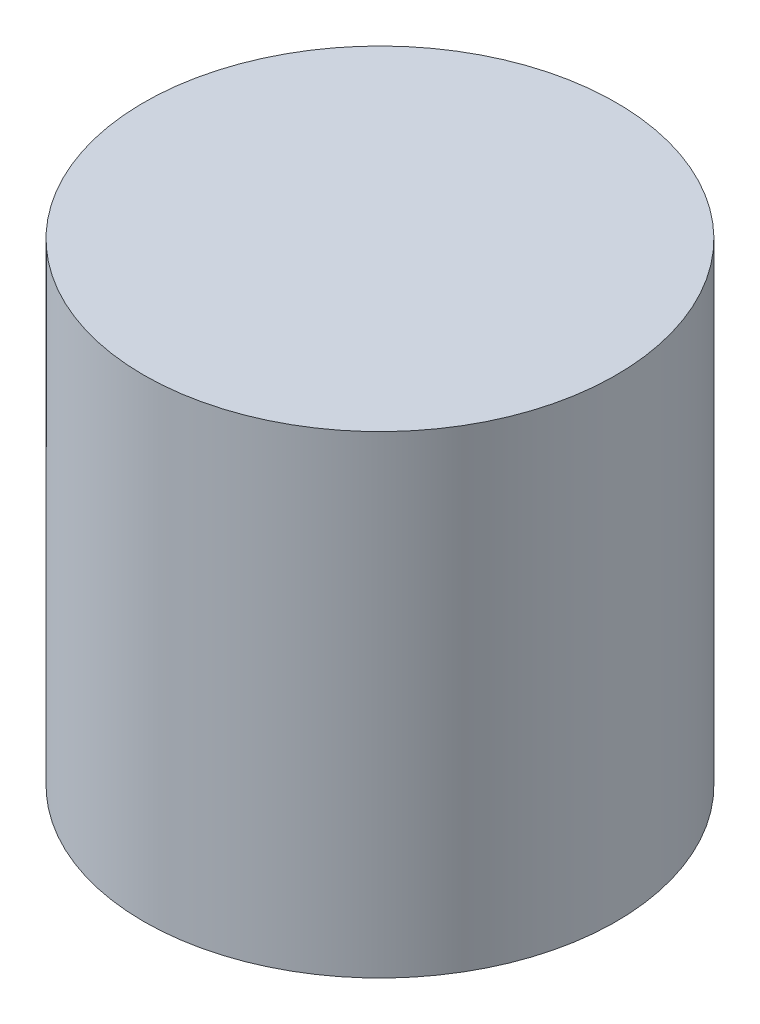
ISO-10303-21;
HEADER;
FILE_DESCRIPTION(('STEP AP214'),'2;1');
FILE_NAME('part.step','',(''),(''),'','','');
FILE_SCHEMA(('AUTOMOTIVE_DESIGN { 1 0 10303 214 1 1 1 1 }'));
ENDSEC;
DATA;
#1=APPLICATION_CONTEXT('core data for automotive mechanical design processes');
#2=APPLICATION_PROTOCOL_DEFINITION('international standard','automotive_design',2000,#1);
#3=PRODUCT_CONTEXT('',#1,'mechanical');
#4=PRODUCT('Part','Part','',(#3));
#5=PRODUCT_RELATED_PRODUCT_CATEGORY('part','',(#4));
#6=PRODUCT_DEFINITION_FORMATION('','',#4);
#7=PRODUCT_DEFINITION_CONTEXT('part definition',#1,'design');
#8=PRODUCT_DEFINITION('design','',#6,#7);
#9=PRODUCT_DEFINITION_SHAPE('','',#8);
#10=(LENGTH_UNIT() NAMED_UNIT(*) SI_UNIT(.MILLI.,.METRE.));
#11=(NAMED_UNIT(*) PLANE_ANGLE_UNIT() SI_UNIT($,.RADIAN.));
#12=(NAMED_UNIT(*) SI_UNIT($,.STERADIAN.) SOLID_ANGLE_UNIT());
#13=UNCERTAINTY_MEASURE_WITH_UNIT(LENGTH_MEASURE(1.E-05),#10,'distance_accuracy_value','');
#14=(GEOMETRIC_REPRESENTATION_CONTEXT(3) GLOBAL_UNCERTAINTY_ASSIGNED_CONTEXT((#13)) GLOBAL_UNIT_ASSIGNED_CONTEXT((#10,
#11,#12)) REPRESENTATION_CONTEXT('',''));
#15=CARTESIAN_POINT('',(0.,0.,0.));
#16=DIRECTION('',(0.,0.,1.));
#17=DIRECTION('',(1.,0.,0.));
#18=AXIS2_PLACEMENT_3D('',#15,#16,#17);
#19=CARTESIAN_POINT('',(0.,10.,0.));
#20=DIRECTION('',(0.,-1.,0.));
#21=DIRECTION('',(0.,0.,-1.));
#22=AXIS2_PLACEMENT_3D('',#19,#20,#21);
#23=CYLINDRICAL_SURFACE('',#22,4.99);
#24=CARTESIAN_POINT('',(0.,10.,0.));
#25=DIRECTION('',(0.,1.,0.));
#26=DIRECTION('',(0.,0.,1.));
#27=AXIS2_PLACEMENT_3D('',#24,#25,#26);
#28=CIRCLE('',#27,4.99);
#29=CARTESIAN_POINT('',(0.,10.,4.99));
#30=VERTEX_POINT('',#29);
#31=EDGE_CURVE('E10',#30,#30,#28,.T.);
#32=ORIENTED_EDGE('',*,*,#31,.F.);
#33=EDGE_LOOP('',(#32));
#34=FACE_BOUND('',#33,.T.);
#35=CARTESIAN_POINT('',(0.,0.,0.));
#36=DIRECTION('',(0.,1.,0.));
#37=DIRECTION('',(0.,0.,1.));
#38=AXIS2_PLACEMENT_3D('',#35,#36,#37);
#39=CIRCLE('',#38,4.99);
#40=CARTESIAN_POINT('',(0.,0.,4.99));
#41=VERTEX_POINT('',#40);
#42=EDGE_CURVE('E46',#41,#41,#39,.T.);
#43=ORIENTED_EDGE('',*,*,#42,.T.);
#44=EDGE_LOOP('',(#43));
#45=FACE_BOUND('',#44,.T.);
#46=ADVANCED_FACE('F43',(#34,#45),#23,.T.);
#47=CARTESIAN_POINT('',(0.,10.,0.));
#48=DIRECTION('',(0.,1.,0.));
#49=DIRECTION('',(0.,0.,1.));
#50=AXIS2_PLACEMENT_3D('',#47,#48,#49);
#51=PLANE('',#50);
#52=ORIENTED_EDGE('',*,*,#31,.T.);
#53=EDGE_LOOP('',(#52));
#54=FACE_BOUND('',#53,.T.);
#55=ADVANCED_FACE('F60',(#54),#51,.T.);
#56=CARTESIAN_POINT('',(0.,0.,0.));
#57=DIRECTION('',(0.,1.,0.));
#58=DIRECTION('',(0.,0.,1.));
#59=AXIS2_PLACEMENT_3D('',#56,#57,#58);
#60=PLANE('',#59);
#61=ORIENTED_EDGE('',*,*,#42,.F.);
#62=EDGE_LOOP('',(#61));
#63=FACE_BOUND('',#62,.T.);
#64=ADVANCED_FACE('F58',(#63),#60,.F.);
#65=CLOSED_SHELL('',(#46,#55,#64));
#66=MANIFOLD_SOLID_BREP('B2',#65);
#67=ADVANCED_BREP_SHAPE_REPRESENTATION('',(#18,#66),#14);
#68=SHAPE_DEFINITION_REPRESENTATION(#9,#67);
ENDSEC;
END-ISO-10303-21;
